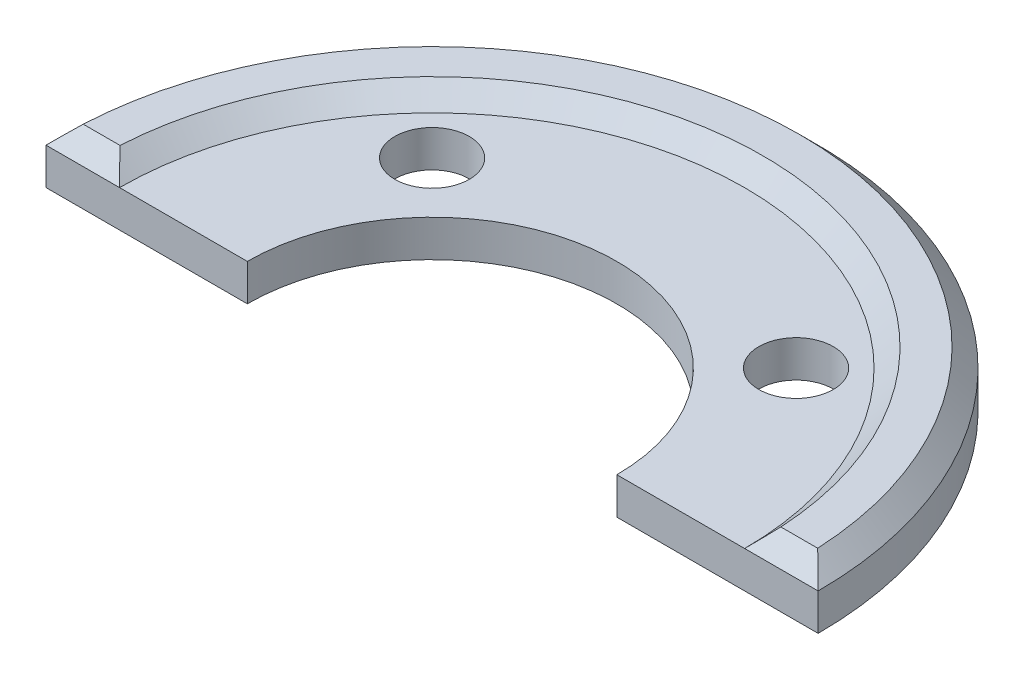
ISO-10303-21;
HEADER;
FILE_DESCRIPTION(('STEP AP214'),'2;1');
FILE_NAME('part.step','',(''),(''),'','','');
FILE_SCHEMA(('AUTOMOTIVE_DESIGN { 1 0 10303 214 1 1 1 1 }'));
ENDSEC;
DATA;
#1=APPLICATION_CONTEXT('core data for automotive mechanical design processes');
#2=APPLICATION_PROTOCOL_DEFINITION('international standard','automotive_design',2000,#1);
#3=PRODUCT_CONTEXT('',#1,'mechanical');
#4=PRODUCT('Part','Part','',(#3));
#5=PRODUCT_RELATED_PRODUCT_CATEGORY('part','',(#4));
#6=PRODUCT_DEFINITION_FORMATION('','',#4);
#7=PRODUCT_DEFINITION_CONTEXT('part definition',#1,'design');
#8=PRODUCT_DEFINITION('design','',#6,#7);
#9=PRODUCT_DEFINITION_SHAPE('','',#8);
#10=(LENGTH_UNIT() NAMED_UNIT(*) SI_UNIT(.MILLI.,.METRE.));
#11=(NAMED_UNIT(*) PLANE_ANGLE_UNIT() SI_UNIT($,.RADIAN.));
#12=(NAMED_UNIT(*) SI_UNIT($,.STERADIAN.) SOLID_ANGLE_UNIT());
#13=UNCERTAINTY_MEASURE_WITH_UNIT(LENGTH_MEASURE(1.E-05),#10,'distance_accuracy_value','');
#14=(GEOMETRIC_REPRESENTATION_CONTEXT(3) GLOBAL_UNCERTAINTY_ASSIGNED_CONTEXT((#13)) GLOBAL_UNIT_ASSIGNED_CONTEXT((#10,
#11,#12)) REPRESENTATION_CONTEXT('',''));
#15=CARTESIAN_POINT('',(0.,0.,0.));
#16=DIRECTION('',(0.,0.,1.));
#17=DIRECTION('',(1.,0.,0.));
#18=AXIS2_PLACEMENT_3D('',#15,#16,#17);
#19=CARTESIAN_POINT('',(0.,3.,0.));
#20=DIRECTION('',(0.,-1.,0.));
#21=DIRECTION('',(0.,0.,-1.));
#22=AXIS2_PLACEMENT_3D('',#19,#20,#21);
#23=CYLINDRICAL_SURFACE('',#22,10.05);
#24=CARTESIAN_POINT('',(0.,2.,0.));
#25=DIRECTION('',(0.,1.,0.));
#26=DIRECTION('',(0.,0.,1.));
#27=AXIS2_PLACEMENT_3D('',#24,#25,#26);
#28=CIRCLE('',#27,10.05);
#29=CARTESIAN_POINT('',(-10.05,2.,0.));
#30=VERTEX_POINT('',#29);
#31=CARTESIAN_POINT('',(10.05,2.,0.));
#32=VERTEX_POINT('',#31);
#33=EDGE_CURVE('E132',#30,#32,#28,.F.);
#34=ORIENTED_EDGE('',*,*,#33,.F.);
#35=DIRECTION('',(0.,-1.,0.));
#36=VECTOR('',#35,1.);
#37=CARTESIAN_POINT('',(-10.05,3.,0.));
#38=LINE('',#37,#36);
#39=CARTESIAN_POINT('',(-10.05,0.,0.));
#40=VERTEX_POINT('',#39);
#41=EDGE_CURVE('E139',#30,#40,#38,.T.);
#42=ORIENTED_EDGE('',*,*,#41,.T.);
#43=CARTESIAN_POINT('',(0.,0.,0.));
#44=DIRECTION('',(0.,-1.,0.));
#45=DIRECTION('',(0.,0.,1.));
#46=AXIS2_PLACEMENT_3D('',#43,#44,#45);
#47=CIRCLE('',#46,10.05);
#48=CARTESIAN_POINT('',(10.05,0.,0.));
#49=VERTEX_POINT('',#48);
#50=EDGE_CURVE('E127',#40,#49,#47,.T.);
#51=ORIENTED_EDGE('',*,*,#50,.T.);
#52=DIRECTION('',(0.,-1.,0.));
#53=VECTOR('',#52,1.);
#54=CARTESIAN_POINT('',(10.05,3.,0.));
#55=LINE('',#54,#53);
#56=EDGE_CURVE('E137',#32,#49,#55,.T.);
#57=ORIENTED_EDGE('',*,*,#56,.F.);
#58=EDGE_LOOP('',(#34,#42,#51,#57));
#59=FACE_BOUND('',#58,.T.);
#60=ADVANCED_FACE('F46',(#59),#23,.F.);
#61=CARTESIAN_POINT('',(-10.05,3.,0.));
#62=DIRECTION('',(0.,0.,-1.));
#63=DIRECTION('',(-1.,0.,0.));
#64=AXIS2_PLACEMENT_3D('',#61,#62,#63);
#65=PLANE('',#64);
#66=DIRECTION('',(1.,0.,0.));
#67=VECTOR('',#66,1.);
#68=CARTESIAN_POINT('',(-10.05,2.,0.));
#69=LINE('',#68,#67);
#70=CARTESIAN_POINT('',(-17.,2.,0.));
#71=VERTEX_POINT('',#70);
#72=EDGE_CURVE('E128',#71,#30,#69,.T.);
#73=ORIENTED_EDGE('',*,*,#72,.F.);
#74=DIRECTION('',(-1.,0.,0.));
#75=VECTOR('',#74,1.);
#76=CARTESIAN_POINT('',(-21.,1.99999999999999,0.));
#77=LINE('',#76,#75);
#78=CARTESIAN_POINT('',(-21.,1.99999999999999,0.));
#79=VERTEX_POINT('',#78);
#80=EDGE_CURVE('E60',#71,#79,#77,.T.);
#81=ORIENTED_EDGE('',*,*,#80,.T.);
#82=DIRECTION('',(0.,1.,0.));
#83=VECTOR('',#82,1.);
#84=CARTESIAN_POINT('',(-21.,0.,0.));
#85=LINE('',#84,#83);
#86=CARTESIAN_POINT('',(-21.,0.,0.));
#87=VERTEX_POINT('',#86);
#88=EDGE_CURVE('E111',#87,#79,#85,.T.);
#89=ORIENTED_EDGE('',*,*,#88,.F.);
#90=DIRECTION('',(1.,0.,0.));
#91=VECTOR('',#90,1.);
#92=CARTESIAN_POINT('',(-10.05,0.,0.));
#93=LINE('',#92,#91);
#94=EDGE_CURVE('E121',#87,#40,#93,.T.);
#95=ORIENTED_EDGE('',*,*,#94,.T.);
#96=ORIENTED_EDGE('',*,*,#41,.F.);
#97=EDGE_LOOP('',(#73,#81,#89,#95,#96));
#98=FACE_BOUND('',#97,.T.);
#99=ADVANCED_FACE('F119',(#98),#65,.F.);
#100=CARTESIAN_POINT('',(39.,3.,0.));
#101=DIRECTION('',(0.,0.,-1.));
#102=DIRECTION('',(-1.,0.,0.));
#103=AXIS2_PLACEMENT_3D('',#100,#101,#102);
#104=PLANE('',#103);
#105=DIRECTION('',(0.,1.,0.));
#106=VECTOR('',#105,1.);
#107=CARTESIAN_POINT('',(21.,0.,0.));
#108=LINE('',#107,#106);
#109=CARTESIAN_POINT('',(21.,0.,0.));
#110=VERTEX_POINT('',#109);
#111=CARTESIAN_POINT('',(21.,1.99999999999999,0.));
#112=VERTEX_POINT('',#111);
#113=EDGE_CURVE('E113',#110,#112,#108,.T.);
#114=ORIENTED_EDGE('',*,*,#113,.T.);
#115=DIRECTION('',(-1.,0.,0.));
#116=VECTOR('',#115,1.);
#117=CARTESIAN_POINT('',(17.,1.99999999999999,0.));
#118=LINE('',#117,#116);
#119=CARTESIAN_POINT('',(17.,2.,0.));
#120=VERTEX_POINT('',#119);
#121=EDGE_CURVE('E153',#112,#120,#118,.T.);
#122=ORIENTED_EDGE('',*,*,#121,.T.);
#123=DIRECTION('',(1.,0.,0.));
#124=VECTOR('',#123,1.);
#125=CARTESIAN_POINT('',(39.,2.,0.));
#126=LINE('',#125,#124);
#127=EDGE_CURVE('E141',#32,#120,#126,.T.);
#128=ORIENTED_EDGE('',*,*,#127,.F.);
#129=ORIENTED_EDGE('',*,*,#56,.T.);
#130=DIRECTION('',(1.,0.,0.));
#131=VECTOR('',#130,1.);
#132=CARTESIAN_POINT('',(39.,0.,0.));
#133=LINE('',#132,#131);
#134=EDGE_CURVE('E130',#49,#110,#133,.T.);
#135=ORIENTED_EDGE('',*,*,#134,.T.);
#136=EDGE_LOOP('',(#114,#122,#128,#129,#135));
#137=FACE_BOUND('',#136,.T.);
#138=ADVANCED_FACE('F196',(#137),#104,.F.);
#139=CARTESIAN_POINT('',(0.,3.,0.));
#140=DIRECTION('',(0.,1.,0.));
#141=DIRECTION('',(0.,0.,1.));
#142=AXIS2_PLACEMENT_3D('',#139,#140,#141);
#143=PLANE('',#142);
#144=CARTESIAN_POINT('',(0.,3.,0.));
#145=DIRECTION('',(0.,1.,0.));
#146=DIRECTION('',(0.,0.,1.));
#147=AXIS2_PLACEMENT_3D('',#144,#145,#146);
#148=CIRCLE('',#147,18.);
#149=CARTESIAN_POINT('',(-17.9722007556114,3.,-1.00000000000001));
#150=VERTEX_POINT('',#149);
#151=CARTESIAN_POINT('',(17.9722007556114,3.,-1.00000000000001));
#152=VERTEX_POINT('',#151);
#153=EDGE_CURVE('E148',#150,#152,#148,.F.);
#154=ORIENTED_EDGE('',*,*,#153,.T.);
#155=DIRECTION('',(1.,0.,0.));
#156=VECTOR('',#155,1.);
#157=CARTESIAN_POINT('',(21.,3.,-1.00000000000001));
#158=LINE('',#157,#156);
#159=CARTESIAN_POINT('',(19.9749843554382,3.,-1.00000000000001));
#160=VERTEX_POINT('',#159);
#161=EDGE_CURVE('E150',#152,#160,#158,.T.);
#162=ORIENTED_EDGE('',*,*,#161,.T.);
#163=CARTESIAN_POINT('',(0.,3.,0.));
#164=DIRECTION('',(0.,1.,0.));
#165=DIRECTION('',(0.,0.,1.));
#166=AXIS2_PLACEMENT_3D('',#163,#164,#165);
#167=CIRCLE('',#166,20.);
#168=CARTESIAN_POINT('',(-19.9749843554382,3.,-1.00000000000001));
#169=VERTEX_POINT('',#168);
#170=EDGE_CURVE('E144',#160,#169,#167,.T.);
#171=ORIENTED_EDGE('',*,*,#170,.T.);
#172=DIRECTION('',(1.,0.,0.));
#173=VECTOR('',#172,1.);
#174=CARTESIAN_POINT('',(-17.,3.,-1.00000000000001));
#175=LINE('',#174,#173);
#176=EDGE_CURVE('E146',#169,#150,#175,.T.);
#177=ORIENTED_EDGE('',*,*,#176,.T.);
#178=EDGE_LOOP('',(#154,#162,#171,#177));
#179=FACE_BOUND('',#178,.T.);
#180=ADVANCED_FACE('F201',(#179),#143,.T.);
#181=CARTESIAN_POINT('',(0.,0.,0.));
#182=DIRECTION('',(0.,1.,0.));
#183=DIRECTION('',(0.,0.,1.));
#184=AXIS2_PLACEMENT_3D('',#181,#182,#183);
#185=PLANE('',#184);
#186=CARTESIAN_POINT('',(9.89949493661172,0.,-9.89949493661161));
#187=DIRECTION('',(0.,1.,0.));
#188=DIRECTION('',(-1.,0.,0.));
#189=AXIS2_PLACEMENT_3D('',#186,#187,#188);
#190=CIRCLE('',#189,2.025);
#191=CARTESIAN_POINT('',(7.87449493661172,0.,-9.89949493661162));
#192=VERTEX_POINT('',#191);
#193=EDGE_CURVE('E341',#192,#192,#190,.T.);
#194=ORIENTED_EDGE('',*,*,#193,.T.);
#195=EDGE_LOOP('',(#194));
#196=FACE_BOUND('',#195,.T.);
#197=CARTESIAN_POINT('',(-9.89949493661165,0.,-9.89949493661168));
#198=DIRECTION('',(0.,1.,0.));
#199=DIRECTION('',(0.,0.,1.));
#200=AXIS2_PLACEMENT_3D('',#197,#198,#199);
#201=CIRCLE('',#200,2.025);
#202=CARTESIAN_POINT('',(-9.89949493661165,0.,-7.87449493661168));
#203=VERTEX_POINT('',#202);
#204=EDGE_CURVE('E350',#203,#203,#201,.T.);
#205=ORIENTED_EDGE('',*,*,#204,.T.);
#206=EDGE_LOOP('',(#205));
#207=FACE_BOUND('',#206,.T.);
#208=ORIENTED_EDGE('',*,*,#94,.F.);
#209=CARTESIAN_POINT('',(0.,0.,0.));
#210=DIRECTION('',(0.,-1.,0.));
#211=DIRECTION('',(0.,0.,1.));
#212=AXIS2_PLACEMENT_3D('',#209,#210,#211);
#213=CIRCLE('',#212,21.);
#214=EDGE_CURVE('E109',#87,#110,#213,.T.);
#215=ORIENTED_EDGE('',*,*,#214,.T.);
#216=ORIENTED_EDGE('',*,*,#134,.F.);
#217=ORIENTED_EDGE('',*,*,#50,.F.);
#218=EDGE_LOOP('',(#208,#215,#216,#217));
#219=FACE_BOUND('',#218,.T.);
#220=ADVANCED_FACE('F125',(#196,#207,#219),#185,.F.);
#221=CARTESIAN_POINT('',(0.,2.,0.));
#222=DIRECTION('',(0.,1.,0.));
#223=DIRECTION('',(0.,0.,1.));
#224=AXIS2_PLACEMENT_3D('',#221,#222,#223);
#225=PLANE('',#224);
#226=CARTESIAN_POINT('',(9.89949493661172,2.,-9.89949493661161));
#227=DIRECTION('',(0.,1.,0.));
#228=DIRECTION('',(-1.,0.,0.));
#229=AXIS2_PLACEMENT_3D('',#226,#227,#228);
#230=CIRCLE('',#229,2.025);
#231=CARTESIAN_POINT('',(7.87449493661172,2.,-9.89949493661162));
#232=VERTEX_POINT('',#231);
#233=EDGE_CURVE('E344',#232,#232,#230,.T.);
#234=ORIENTED_EDGE('',*,*,#233,.F.);
#235=EDGE_LOOP('',(#234));
#236=FACE_BOUND('',#235,.T.);
#237=CARTESIAN_POINT('',(-9.89949493661165,2.,-9.89949493661168));
#238=DIRECTION('',(0.,1.,0.));
#239=DIRECTION('',(0.,0.,1.));
#240=AXIS2_PLACEMENT_3D('',#237,#238,#239);
#241=CIRCLE('',#240,2.025);
#242=CARTESIAN_POINT('',(-9.89949493661165,2.,-7.87449493661168));
#243=VERTEX_POINT('',#242);
#244=EDGE_CURVE('E346',#243,#243,#241,.T.);
#245=ORIENTED_EDGE('',*,*,#244,.F.);
#246=EDGE_LOOP('',(#245));
#247=FACE_BOUND('',#246,.T.);
#248=ORIENTED_EDGE('',*,*,#72,.T.);
#249=ORIENTED_EDGE('',*,*,#33,.T.);
#250=ORIENTED_EDGE('',*,*,#127,.T.);
#251=CARTESIAN_POINT('',(0.,2.,0.));
#252=DIRECTION('',(0.,1.,0.));
#253=DIRECTION('',(0.,0.,1.));
#254=AXIS2_PLACEMENT_3D('',#251,#252,#253);
#255=CIRCLE('',#254,17.);
#256=EDGE_CURVE('E353',#120,#71,#255,.T.);
#257=ORIENTED_EDGE('',*,*,#256,.T.);
#258=EDGE_LOOP('',(#248,#249,#250,#257));
#259=FACE_BOUND('',#258,.T.);
#260=ADVANCED_FACE('F205',(#236,#247,#259),#225,.T.);
#261=CARTESIAN_POINT('',(-9.89949493661165,0.,-9.89949493661168));
#262=DIRECTION('',(0.,1.,0.));
#263=DIRECTION('',(0.,0.,1.));
#264=AXIS2_PLACEMENT_3D('',#261,#262,#263);
#265=CYLINDRICAL_SURFACE('',#264,2.025);
#266=ORIENTED_EDGE('',*,*,#204,.F.);
#267=EDGE_LOOP('',(#266));
#268=FACE_BOUND('',#267,.T.);
#269=ORIENTED_EDGE('',*,*,#244,.T.);
#270=EDGE_LOOP('',(#269));
#271=FACE_BOUND('',#270,.T.);
#272=ADVANCED_FACE('F212',(#268,#271),#265,.F.);
#273=CARTESIAN_POINT('',(9.89949493661172,0.,-9.89949493661161));
#274=DIRECTION('',(0.,1.,0.));
#275=DIRECTION('',(0.,0.,1.));
#276=AXIS2_PLACEMENT_3D('',#273,#274,#275);
#277=CYLINDRICAL_SURFACE('',#276,2.025);
#278=ORIENTED_EDGE('',*,*,#193,.F.);
#279=EDGE_LOOP('',(#278));
#280=FACE_BOUND('',#279,.T.);
#281=ORIENTED_EDGE('',*,*,#233,.T.);
#282=EDGE_LOOP('',(#281));
#283=FACE_BOUND('',#282,.T.);
#284=ADVANCED_FACE('F216',(#280,#283),#277,.F.);
#285=CARTESIAN_POINT('',(0.,0.,0.));
#286=DIRECTION('',(0.,1.,0.));
#287=DIRECTION('',(0.,0.,1.));
#288=AXIS2_PLACEMENT_3D('',#285,#286,#287);
#289=CYLINDRICAL_SURFACE('',#288,21.);
#290=ORIENTED_EDGE('',*,*,#88,.T.);
#291=CARTESIAN_POINT('',(0.,1.99999999999999,0.));
#292=DIRECTION('',(0.,1.,0.));
#293=DIRECTION('',(0.,0.,1.));
#294=AXIS2_PLACEMENT_3D('',#291,#292,#293);
#295=CIRCLE('',#294,21.);
#296=EDGE_CURVE('E11',#79,#112,#295,.F.);
#297=ORIENTED_EDGE('',*,*,#296,.T.);
#298=ORIENTED_EDGE('',*,*,#113,.F.);
#299=ORIENTED_EDGE('',*,*,#214,.F.);
#300=EDGE_LOOP('',(#290,#297,#298,#299));
#301=FACE_BOUND('',#300,.T.);
#302=ADVANCED_FACE('F110',(#301),#289,.T.);
#303=CARTESIAN_POINT('',(0.,3.,-1.));
#304=DIRECTION('',(0.,0.707106781186549,0.707106781186546));
#305=DIRECTION('',(-1.,0.,0.));
#306=AXIS2_PLACEMENT_3D('',#303,#304,#305);
#307=PLANE('',#306);
#308=CARTESIAN_POINT('',(-21.,1.99999999999999,0.));
#309=CARTESIAN_POINT('',(-20.9159626182289,2.08403723705746,-0.0840372370574626));
#310=CARTESIAN_POINT('',(-20.8315890595781,2.16790649192324,-0.167906491923242));
#311=CARTESIAN_POINT('',(-20.6621586575016,2.33529470321822,-0.335294703218226));
#312=CARTESIAN_POINT('',(-20.5771018383149,2.41881367191541,-0.418813671915416));
#313=CARTESIAN_POINT('',(-20.4062878654015,2.58549309467166,-0.585493094671671));
#314=CARTESIAN_POINT('',(-20.3205307101641,2.66865354795678,-0.668653547956791));
#315=CARTESIAN_POINT('',(-20.148298705777,2.83460651994776,-0.834606519947766));
#316=CARTESIAN_POINT('',(-20.061823831384,2.9173990255537,-0.917399025553706));
#317=CARTESIAN_POINT('',(-19.9749843554382,3.,-1.00000000000001));
#318=B_SPLINE_CURVE_WITH_KNOTS('',3,(#308,#309,#310,#311,#312,#313,#314,#315,#316,#317),
.UNSPECIFIED.,.F.,.F.,(4,2,2,2,4),(0.,0.436670138475017,0.873324853670169,1.30998051102186,
1.74665159189664),.UNSPECIFIED.);
#319=EDGE_CURVE('E366',#79,#169,#318,.T.);
#320=ORIENTED_EDGE('',*,*,#319,.F.);
#321=ORIENTED_EDGE('',*,*,#80,.F.);
#322=CARTESIAN_POINT('',(-17.,1.99999999999999,0.));
#323=CARTESIAN_POINT('',(-17.0825724471272,2.08257268331787,-0.0825726833178725));
#324=CARTESIAN_POINT('',(-17.1647440268418,2.16534563376912,-0.165345633769125));
#325=CARTESIAN_POINT('',(-17.3283007011167,2.33127399276026,-0.331273992760266));
#326=CARTESIAN_POINT('',(-17.4096858286421,2.41442938505207,-0.414429385052073));
#327=CARTESIAN_POINT('',(-17.571691554429,2.581111256372,-0.581111256372002));
#328=CARTESIAN_POINT('',(-17.6523121549849,2.6646377342853,-0.664637734285311));
#329=CARTESIAN_POINT('',(-17.8128102384174,2.8320520653915,-0.832052065391503));
#330=CARTESIAN_POINT('',(-17.8926876898654,2.91593993365045,-0.915939933650458));
#331=CARTESIAN_POINT('',(-17.9722007556115,2.99999999999999,-0.999999999999995));
#332=B_SPLINE_CURVE_WITH_KNOTS('',3,(#322,#323,#324,#325,#326,#327,#328,#329,#330,#331),
.UNSPECIFIED.,.F.,.F.,(4,2,2,2,4),(0.,0.429058720978786,0.858099378707715,1.28713874838643,
1.71619618088377),.UNSPECIFIED.);
#333=EDGE_CURVE('E51',#150,#71,#332,.F.);
#334=ORIENTED_EDGE('',*,*,#333,.F.);
#335=ORIENTED_EDGE('',*,*,#176,.F.);
#336=EDGE_LOOP('',(#320,#321,#334,#335));
#337=FACE_BOUND('',#336,.T.);
#338=ADVANCED_FACE('F48',(#337),#307,.T.);
#339=CARTESIAN_POINT('',(0.,1.99999999999999,0.));
#340=DIRECTION('',(0.,1.,0.));
#341=DIRECTION('',(0.,0.,1.));
#342=AXIS2_PLACEMENT_3D('',#339,#340,#341);
#343=CONICAL_SURFACE('',#342,17.,0.78539816339745);
#344=ORIENTED_EDGE('',*,*,#333,.T.);
#345=ORIENTED_EDGE('',*,*,#256,.F.);
#346=CARTESIAN_POINT('',(17.,1.99999999999999,0.));
#347=CARTESIAN_POINT('',(17.0825724471272,2.08257268331787,-0.0825726833178728));
#348=CARTESIAN_POINT('',(17.1647440268418,2.16534563376912,-0.165345633769125));
#349=CARTESIAN_POINT('',(17.3283007011167,2.33127399276026,-0.331273992760266));
#350=CARTESIAN_POINT('',(17.4096858286421,2.41442938505207,-0.414429385052073));
#351=CARTESIAN_POINT('',(17.571691554429,2.581111256372,-0.581111256372002));
#352=CARTESIAN_POINT('',(17.6523121549849,2.6646377342853,-0.664637734285311));
#353=CARTESIAN_POINT('',(17.8128102384174,2.8320520653915,-0.832052065391504));
#354=CARTESIAN_POINT('',(17.8926876898654,2.91593993365045,-0.915939933650459));
#355=CARTESIAN_POINT('',(17.9722007556115,2.99999999999999,-0.999999999999995));
#356=B_SPLINE_CURVE_WITH_KNOTS('',3,(#346,#347,#348,#349,#350,#351,#352,#353,#354,#355),
.UNSPECIFIED.,.F.,.F.,(4,2,2,2,4),(0.,0.429058720978786,0.858099378707715,1.28713874838643,
1.71619618088377),.UNSPECIFIED.);
#357=EDGE_CURVE('E165',#152,#120,#356,.F.);
#358=ORIENTED_EDGE('',*,*,#357,.F.);
#359=ORIENTED_EDGE('',*,*,#153,.F.);
#360=EDGE_LOOP('',(#344,#345,#358,#359));
#361=FACE_BOUND('',#360,.T.);
#362=ADVANCED_FACE('F177',(#361),#343,.F.);
#363=CARTESIAN_POINT('',(0.,1.99999999999999,0.));
#364=DIRECTION('',(0.,-1.,0.));
#365=DIRECTION('',(0.,0.,-1.));
#366=AXIS2_PLACEMENT_3D('',#363,#364,#365);
#367=CONICAL_SURFACE('',#366,21.,0.78539816339745);
#368=ORIENTED_EDGE('',*,*,#319,.T.);
#369=ORIENTED_EDGE('',*,*,#170,.F.);
#370=CARTESIAN_POINT('',(19.9749843554382,3.,-1.00000000000001));
#371=CARTESIAN_POINT('',(20.061823831384,2.9173990255537,-0.917399025553706));
#372=CARTESIAN_POINT('',(20.148298705777,2.83460651994776,-0.834606519947767));
#373=CARTESIAN_POINT('',(20.320530710164,2.66865354795679,-0.668653547956793));
#374=CARTESIAN_POINT('',(20.4062878654015,2.58549309467167,-0.585493094671673));
#375=CARTESIAN_POINT('',(20.5771018383149,2.41881367191541,-0.418813671915417));
#376=CARTESIAN_POINT('',(20.6621586575016,2.33529470321822,-0.335294703218226));
#377=CARTESIAN_POINT('',(20.8315890595781,2.16790649192324,-0.167906491923242));
#378=CARTESIAN_POINT('',(20.9159626182289,2.08403723705746,-0.0840372370574643));
#379=CARTESIAN_POINT('',(21.,2.,0.));
#380=B_SPLINE_CURVE_WITH_KNOTS('',3,(#370,#371,#372,#373,#374,#375,#376,#377,#378,#379),
.UNSPECIFIED.,.F.,.F.,(4,2,2,2,4),(0.,0.436671080874774,0.87332673822647,1.30998145342162,
1.74665159189664),.UNSPECIFIED.);
#381=EDGE_CURVE('E157',#112,#160,#380,.F.);
#382=ORIENTED_EDGE('',*,*,#381,.F.);
#383=ORIENTED_EDGE('',*,*,#296,.F.);
#384=EDGE_LOOP('',(#368,#369,#382,#383));
#385=FACE_BOUND('',#384,.T.);
#386=ADVANCED_FACE('F170',(#385),#367,.T.);
#387=CARTESIAN_POINT('',(0.,3.,-1.));
#388=DIRECTION('',(0.,0.707106781186549,0.707106781186546));
#389=DIRECTION('',(-1.,0.,0.));
#390=AXIS2_PLACEMENT_3D('',#387,#388,#389);
#391=PLANE('',#390);
#392=ORIENTED_EDGE('',*,*,#357,.T.);
#393=ORIENTED_EDGE('',*,*,#121,.F.);
#394=ORIENTED_EDGE('',*,*,#381,.T.);
#395=ORIENTED_EDGE('',*,*,#161,.F.);
#396=EDGE_LOOP('',(#392,#393,#394,#395));
#397=FACE_BOUND('',#396,.T.);
#398=ADVANCED_FACE('F173',(#397),#391,.T.);
#399=CLOSED_SHELL('',(#60,#99,#138,#180,#220,#260,#272,#284,#302,#338,#362,#386,#398));
#400=MANIFOLD_SOLID_BREP('B2',#399);
#401=ADVANCED_BREP_SHAPE_REPRESENTATION('',(#18,#400),#14);
#402=SHAPE_DEFINITION_REPRESENTATION(#9,#401);
ENDSEC;
END-ISO-10303-21;
